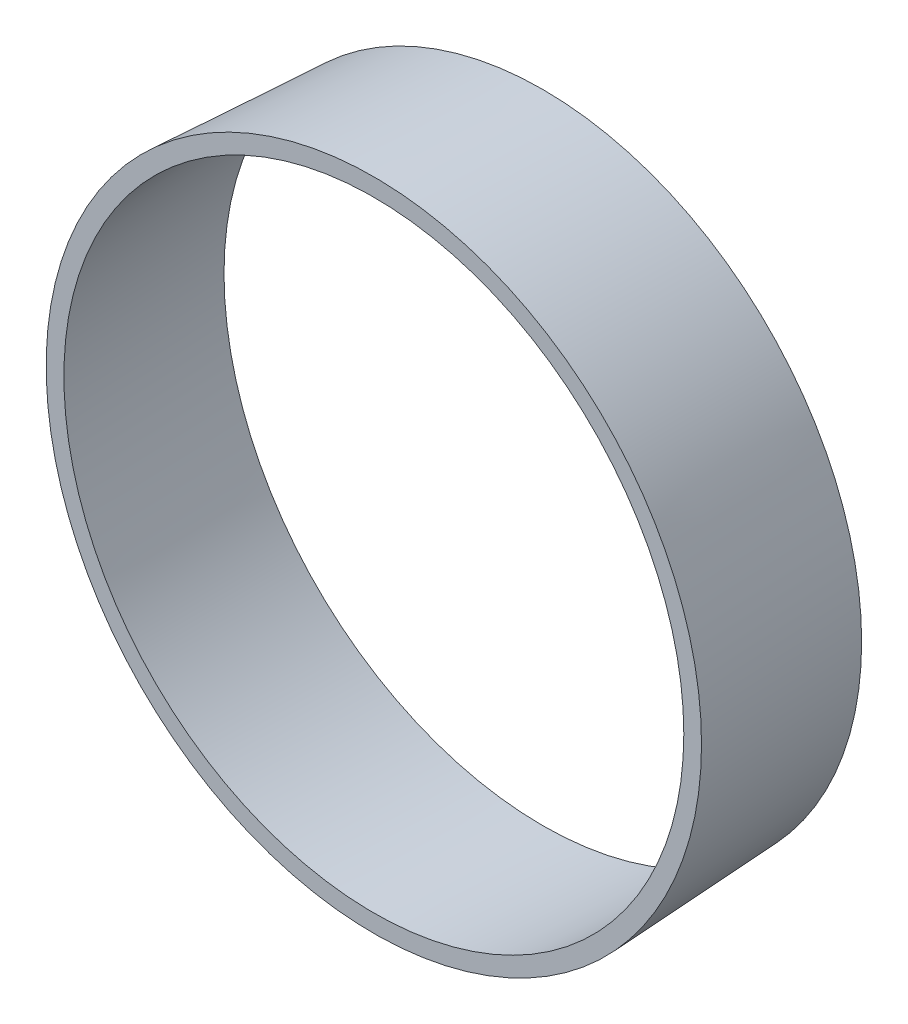
ISO-10303-21;
HEADER;
FILE_DESCRIPTION(('STEP AP214'),'2;1');
FILE_NAME('part.step','',(''),(''),'','','');
FILE_SCHEMA(('AUTOMOTIVE_DESIGN { 1 0 10303 214 1 1 1 1 }'));
ENDSEC;
DATA;
#1=APPLICATION_CONTEXT('core data for automotive mechanical design processes');
#2=APPLICATION_PROTOCOL_DEFINITION('international standard','automotive_design',2000,#1);
#3=PRODUCT_CONTEXT('',#1,'mechanical');
#4=PRODUCT('Part','Part','',(#3));
#5=PRODUCT_RELATED_PRODUCT_CATEGORY('part','',(#4));
#6=PRODUCT_DEFINITION_FORMATION('','',#4);
#7=PRODUCT_DEFINITION_CONTEXT('part definition',#1,'design');
#8=PRODUCT_DEFINITION('design','',#6,#7);
#9=PRODUCT_DEFINITION_SHAPE('','',#8);
#10=(LENGTH_UNIT() NAMED_UNIT(*) SI_UNIT(.MILLI.,.METRE.));
#11=(NAMED_UNIT(*) PLANE_ANGLE_UNIT() SI_UNIT($,.RADIAN.));
#12=(NAMED_UNIT(*) SI_UNIT($,.STERADIAN.) SOLID_ANGLE_UNIT());
#13=UNCERTAINTY_MEASURE_WITH_UNIT(LENGTH_MEASURE(1.E-05),#10,'distance_accuracy_value','');
#14=(GEOMETRIC_REPRESENTATION_CONTEXT(3) GLOBAL_UNCERTAINTY_ASSIGNED_CONTEXT((#13)) GLOBAL_UNIT_ASSIGNED_CONTEXT((#10,
#11,#12)) REPRESENTATION_CONTEXT('',''));
#15=CARTESIAN_POINT('',(0.,0.,0.));
#16=DIRECTION('',(0.,0.,1.));
#17=DIRECTION('',(1.,0.,0.));
#18=AXIS2_PLACEMENT_3D('',#15,#16,#17);
#19=CARTESIAN_POINT('',(0.,0.,0.));
#20=DIRECTION('',(0.,0.,1.));
#21=DIRECTION('',(1.,0.,0.));
#22=AXIS2_PLACEMENT_3D('',#19,#20,#21);
#23=CONICAL_SURFACE('',#22,18.5,0.0523598775598299);
#24=CARTESIAN_POINT('',(0.,0.,0.));
#25=DIRECTION('',(0.,0.,1.));
#26=DIRECTION('',(1.,0.,0.));
#27=AXIS2_PLACEMENT_3D('',#24,#25,#26);
#28=CIRCLE('',#27,18.5);
#29=CARTESIAN_POINT('',(18.5,0.,0.));
#30=VERTEX_POINT('',#29);
#31=EDGE_CURVE('E43',#30,#30,#28,.T.);
#32=ORIENTED_EDGE('',*,*,#31,.F.);
#33=EDGE_LOOP('',(#32));
#34=FACE_BOUND('',#33,.T.);
#35=CARTESIAN_POINT('',(0.,0.,-9.54056834386408));
#36=DIRECTION('',(0.,0.,1.));
#37=DIRECTION('',(1.,0.,0.));
#38=AXIS2_PLACEMENT_3D('',#35,#36,#37);
#39=CIRCLE('',#38,18.);
#40=CARTESIAN_POINT('',(18.,0.,-9.54056834386408));
#41=VERTEX_POINT('',#40);
#42=EDGE_CURVE('E11',#41,#41,#39,.T.);
#43=ORIENTED_EDGE('',*,*,#42,.T.);
#44=EDGE_LOOP('',(#43));
#45=FACE_BOUND('',#44,.T.);
#46=ADVANCED_FACE('F37',(#34,#45),#23,.T.);
#47=CARTESIAN_POINT('',(0.,0.,0.));
#48=DIRECTION('',(0.,0.,1.));
#49=DIRECTION('',(1.,0.,0.));
#50=AXIS2_PLACEMENT_3D('',#47,#48,#49);
#51=PLANE('',#50);
#52=CARTESIAN_POINT('',(0.,0.,0.));
#53=DIRECTION('',(0.,0.,1.));
#54=DIRECTION('',(1.,0.,0.));
#55=AXIS2_PLACEMENT_3D('',#52,#53,#54);
#56=CIRCLE('',#55,17.5);
#57=CARTESIAN_POINT('',(17.5,0.,0.));
#58=VERTEX_POINT('',#57);
#59=EDGE_CURVE('E47',#58,#58,#56,.T.);
#60=ORIENTED_EDGE('',*,*,#59,.F.);
#61=EDGE_LOOP('',(#60));
#62=FACE_BOUND('',#61,.T.);
#63=ORIENTED_EDGE('',*,*,#31,.T.);
#64=EDGE_LOOP('',(#63));
#65=FACE_BOUND('',#64,.T.);
#66=ADVANCED_FACE('F56',(#62,#65),#51,.T.);
#67=CARTESIAN_POINT('',(0.,0.,0.));
#68=DIRECTION('',(0.,0.,-1.));
#69=DIRECTION('',(1.,0.,0.));
#70=AXIS2_PLACEMENT_3D('',#67,#68,#69);
#71=CONICAL_SURFACE('',#70,17.5,0.0523598775598299);
#72=ORIENTED_EDGE('',*,*,#42,.F.);
#73=EDGE_LOOP('',(#72));
#74=FACE_BOUND('',#73,.T.);
#75=ORIENTED_EDGE('',*,*,#59,.T.);
#76=EDGE_LOOP('',(#75));
#77=FACE_BOUND('',#76,.T.);
#78=ADVANCED_FACE('F54',(#74,#77),#71,.F.);
#79=CLOSED_SHELL('',(#46,#66,#78));
#80=MANIFOLD_SOLID_BREP('B2',#79);
#81=ADVANCED_BREP_SHAPE_REPRESENTATION('',(#18,#80),#14);
#82=SHAPE_DEFINITION_REPRESENTATION(#9,#81);
ENDSEC;
END-ISO-10303-21;
